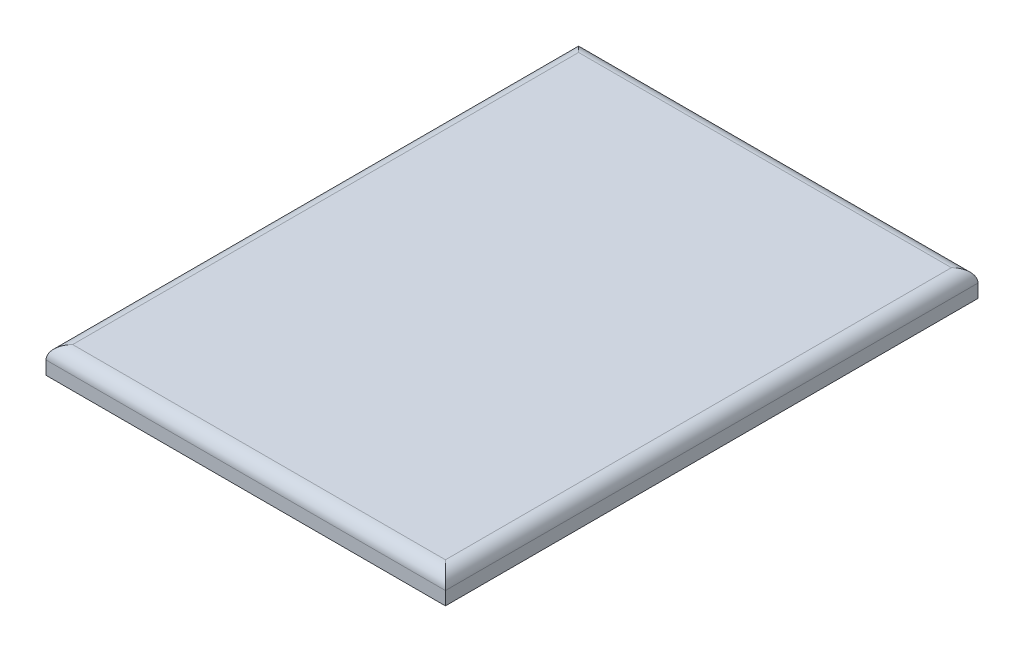
ISO-10303-21;
HEADER;
FILE_DESCRIPTION(('STEP AP214'),'2;1');
FILE_NAME('part.step','',(''),(''),'','','');
FILE_SCHEMA(('AUTOMOTIVE_DESIGN { 1 0 10303 214 1 1 1 1 }'));
ENDSEC;
DATA;
#1=APPLICATION_CONTEXT('core data for automotive mechanical design processes');
#2=APPLICATION_PROTOCOL_DEFINITION('international standard','automotive_design',2000,#1);
#3=PRODUCT_CONTEXT('',#1,'mechanical');
#4=PRODUCT('Part','Part','',(#3));
#5=PRODUCT_RELATED_PRODUCT_CATEGORY('part','',(#4));
#6=PRODUCT_DEFINITION_FORMATION('','',#4);
#7=PRODUCT_DEFINITION_CONTEXT('part definition',#1,'design');
#8=PRODUCT_DEFINITION('design','',#6,#7);
#9=PRODUCT_DEFINITION_SHAPE('','',#8);
#10=(LENGTH_UNIT() NAMED_UNIT(*) SI_UNIT(.MILLI.,.METRE.));
#11=(NAMED_UNIT(*) PLANE_ANGLE_UNIT() SI_UNIT($,.RADIAN.));
#12=(NAMED_UNIT(*) SI_UNIT($,.STERADIAN.) SOLID_ANGLE_UNIT());
#13=UNCERTAINTY_MEASURE_WITH_UNIT(LENGTH_MEASURE(1.E-05),#10,'distance_accuracy_value','');
#14=(GEOMETRIC_REPRESENTATION_CONTEXT(3) GLOBAL_UNCERTAINTY_ASSIGNED_CONTEXT((#13)) GLOBAL_UNIT_ASSIGNED_CONTEXT((#10,
#11,#12)) REPRESENTATION_CONTEXT('',''));
#15=CARTESIAN_POINT('',(0.,0.,0.));
#16=DIRECTION('',(0.,0.,1.));
#17=DIRECTION('',(1.,0.,0.));
#18=AXIS2_PLACEMENT_3D('',#15,#16,#17);
#19=CARTESIAN_POINT('',(1.77852348993288,1.,-11.3758389261745));
#20=DIRECTION('',(1.,0.,0.));
#21=DIRECTION('',(0.,0.,-1.));
#22=AXIS2_PLACEMENT_3D('',#19,#20,#21);
#23=PLANE('',#22);
#24=DIRECTION('',(0.,-1.,0.));
#25=VECTOR('',#24,1.);
#26=CARTESIAN_POINT('',(1.77852348993288,1.,8.6241610738255));
#27=LINE('',#26,#25);
#28=CARTESIAN_POINT('',(1.77852348993288,0.5,8.6241610738255));
#29=VERTEX_POINT('',#28);
#30=CARTESIAN_POINT('',(1.77852348993288,0.,8.6241610738255));
#31=VERTEX_POINT('',#30);
#32=EDGE_CURVE('E86',#29,#31,#27,.T.);
#33=ORIENTED_EDGE('',*,*,#32,.F.);
#34=DIRECTION('',(0.,0.,1.));
#35=VECTOR('',#34,1.);
#36=CARTESIAN_POINT('',(1.77852348993288,0.5,-11.3758389261745));
#37=LINE('',#36,#35);
#38=CARTESIAN_POINT('',(1.77852348993288,0.5,-11.3758389261745));
#39=VERTEX_POINT('',#38);
#40=EDGE_CURVE('E56',#29,#39,#37,.F.);
#41=ORIENTED_EDGE('',*,*,#40,.T.);
#42=DIRECTION('',(0.,-1.,0.));
#43=VECTOR('',#42,1.);
#44=CARTESIAN_POINT('',(1.77852348993288,1.,-11.3758389261745));
#45=LINE('',#44,#43);
#46=CARTESIAN_POINT('',(1.77852348993288,0.,-11.3758389261745));
#47=VERTEX_POINT('',#46);
#48=EDGE_CURVE('E106',#39,#47,#45,.T.);
#49=ORIENTED_EDGE('',*,*,#48,.T.);
#50=DIRECTION('',(0.,0.,1.));
#51=VECTOR('',#50,1.);
#52=CARTESIAN_POINT('',(1.77852348993288,0.,-11.3758389261745));
#53=LINE('',#52,#51);
#54=EDGE_CURVE('E102',#47,#31,#53,.T.);
#55=ORIENTED_EDGE('',*,*,#54,.T.);
#56=EDGE_LOOP('',(#33,#41,#49,#55));
#57=FACE_BOUND('',#56,.T.);
#58=ADVANCED_FACE('F32',(#57),#23,.F.);
#59=CARTESIAN_POINT('',(1.77852348993288,1.,8.6241610738255));
#60=DIRECTION('',(0.,0.,-1.));
#61=DIRECTION('',(-1.,0.,0.));
#62=AXIS2_PLACEMENT_3D('',#59,#60,#61);
#63=PLANE('',#62);
#64=DIRECTION('',(0.,-1.,0.));
#65=VECTOR('',#64,1.);
#66=CARTESIAN_POINT('',(16.7785234899329,1.,8.6241610738255));
#67=LINE('',#66,#65);
#68=CARTESIAN_POINT('',(16.7785234899329,0.5,8.6241610738255));
#69=VERTEX_POINT('',#68);
#70=CARTESIAN_POINT('',(16.7785234899329,0.,8.6241610738255));
#71=VERTEX_POINT('',#70);
#72=EDGE_CURVE('E96',#69,#71,#67,.T.);
#73=ORIENTED_EDGE('',*,*,#72,.F.);
#74=DIRECTION('',(1.,0.,0.));
#75=VECTOR('',#74,1.);
#76=CARTESIAN_POINT('',(1.77852348993288,0.5,8.6241610738255));
#77=LINE('',#76,#75);
#78=EDGE_CURVE('E93',#69,#29,#77,.F.);
#79=ORIENTED_EDGE('',*,*,#78,.T.);
#80=ORIENTED_EDGE('',*,*,#32,.T.);
#81=DIRECTION('',(1.,0.,0.));
#82=VECTOR('',#81,1.);
#83=CARTESIAN_POINT('',(1.77852348993288,0.,8.6241610738255));
#84=LINE('',#83,#82);
#85=EDGE_CURVE('E90',#31,#71,#84,.T.);
#86=ORIENTED_EDGE('',*,*,#85,.T.);
#87=EDGE_LOOP('',(#73,#79,#80,#86));
#88=FACE_BOUND('',#87,.T.);
#89=ADVANCED_FACE('F89',(#88),#63,.F.);
#90=CARTESIAN_POINT('',(16.7785234899329,1.,-11.3758389261745));
#91=DIRECTION('',(-1.,0.,0.));
#92=DIRECTION('',(0.,0.,1.));
#93=AXIS2_PLACEMENT_3D('',#90,#91,#92);
#94=PLANE('',#93);
#95=DIRECTION('',(0.,-1.,0.));
#96=VECTOR('',#95,1.);
#97=CARTESIAN_POINT('',(16.7785234899329,1.,-11.3758389261745));
#98=LINE('',#97,#96);
#99=CARTESIAN_POINT('',(16.7785234899329,0.5,-11.3758389261745));
#100=VERTEX_POINT('',#99);
#101=CARTESIAN_POINT('',(16.7785234899329,0.,-11.3758389261745));
#102=VERTEX_POINT('',#101);
#103=EDGE_CURVE('E116',#100,#102,#98,.T.);
#104=ORIENTED_EDGE('',*,*,#103,.F.);
#105=DIRECTION('',(0.,0.,-1.));
#106=VECTOR('',#105,1.);
#107=CARTESIAN_POINT('',(16.7785234899329,0.5,8.6241610738255));
#108=LINE('',#107,#106);
#109=EDGE_CURVE('E11',#100,#69,#108,.F.);
#110=ORIENTED_EDGE('',*,*,#109,.T.);
#111=ORIENTED_EDGE('',*,*,#72,.T.);
#112=DIRECTION('',(0.,0.,-1.));
#113=VECTOR('',#112,1.);
#114=CARTESIAN_POINT('',(16.7785234899329,0.,-11.3758389261745));
#115=LINE('',#114,#113);
#116=EDGE_CURVE('E104',#71,#102,#115,.T.);
#117=ORIENTED_EDGE('',*,*,#116,.T.);
#118=EDGE_LOOP('',(#104,#110,#111,#117));
#119=FACE_BOUND('',#118,.T.);
#120=ADVANCED_FACE('F163',(#119),#94,.F.);
#121=CARTESIAN_POINT('',(1.77852348993288,1.,-11.3758389261745));
#122=DIRECTION('',(0.,0.,1.));
#123=DIRECTION('',(1.,0.,0.));
#124=AXIS2_PLACEMENT_3D('',#121,#122,#123);
#125=PLANE('',#124);
#126=ORIENTED_EDGE('',*,*,#48,.F.);
#127=DIRECTION('',(-1.,0.,0.));
#128=VECTOR('',#127,1.);
#129=CARTESIAN_POINT('',(16.7785234899329,0.5,-11.3758389261745));
#130=LINE('',#129,#128);
#131=EDGE_CURVE('E41',#39,#100,#130,.F.);
#132=ORIENTED_EDGE('',*,*,#131,.T.);
#133=ORIENTED_EDGE('',*,*,#103,.T.);
#134=DIRECTION('',(-1.,0.,0.));
#135=VECTOR('',#134,1.);
#136=CARTESIAN_POINT('',(1.77852348993288,0.,-11.3758389261745));
#137=LINE('',#136,#135);
#138=EDGE_CURVE('E113',#102,#47,#137,.T.);
#139=ORIENTED_EDGE('',*,*,#138,.T.);
#140=EDGE_LOOP('',(#126,#132,#133,#139));
#141=FACE_BOUND('',#140,.T.);
#142=ADVANCED_FACE('F195',(#141),#125,.F.);
#143=CARTESIAN_POINT('',(0.,1.,0.));
#144=DIRECTION('',(0.,1.,0.));
#145=DIRECTION('',(0.,0.,1.));
#146=AXIS2_PLACEMENT_3D('',#143,#144,#145);
#147=PLANE('',#146);
#148=DIRECTION('',(0.,0.,1.));
#149=VECTOR('',#148,1.);
#150=CARTESIAN_POINT('',(2.27852348993288,1.,8.6241610738255));
#151=LINE('',#150,#149);
#152=CARTESIAN_POINT('',(2.27852348993288,1.,-10.8758389261745));
#153=VERTEX_POINT('',#152);
#154=CARTESIAN_POINT('',(2.27852348993288,1.,8.1241610738255));
#155=VERTEX_POINT('',#154);
#156=EDGE_CURVE('E122',#153,#155,#151,.T.);
#157=ORIENTED_EDGE('',*,*,#156,.T.);
#158=DIRECTION('',(1.,0.,0.));
#159=VECTOR('',#158,1.);
#160=CARTESIAN_POINT('',(16.7785234899329,1.,8.1241610738255));
#161=LINE('',#160,#159);
#162=CARTESIAN_POINT('',(16.2785234899329,1.,8.1241610738255));
#163=VERTEX_POINT('',#162);
#164=EDGE_CURVE('E124',#155,#163,#161,.T.);
#165=ORIENTED_EDGE('',*,*,#164,.T.);
#166=DIRECTION('',(0.,0.,-1.));
#167=VECTOR('',#166,1.);
#168=CARTESIAN_POINT('',(16.2785234899329,1.,-11.3758389261745));
#169=LINE('',#168,#167);
#170=CARTESIAN_POINT('',(16.2785234899329,1.,-10.8758389261745));
#171=VERTEX_POINT('',#170);
#172=EDGE_CURVE('E95',#163,#171,#169,.T.);
#173=ORIENTED_EDGE('',*,*,#172,.T.);
#174=DIRECTION('',(-1.,0.,0.));
#175=VECTOR('',#174,1.);
#176=CARTESIAN_POINT('',(1.77852348993288,1.,-10.8758389261745));
#177=LINE('',#176,#175);
#178=EDGE_CURVE('E120',#171,#153,#177,.T.);
#179=ORIENTED_EDGE('',*,*,#178,.T.);
#180=EDGE_LOOP('',(#157,#165,#173,#179));
#181=FACE_BOUND('',#180,.T.);
#182=ADVANCED_FACE('F145',(#181),#147,.T.);
#183=CARTESIAN_POINT('',(0.,0.,0.));
#184=DIRECTION('',(0.,1.,0.));
#185=DIRECTION('',(0.,0.,1.));
#186=AXIS2_PLACEMENT_3D('',#183,#184,#185);
#187=PLANE('',#186);
#188=ORIENTED_EDGE('',*,*,#54,.F.);
#189=ORIENTED_EDGE('',*,*,#138,.F.);
#190=ORIENTED_EDGE('',*,*,#116,.F.);
#191=ORIENTED_EDGE('',*,*,#85,.F.);
#192=EDGE_LOOP('',(#188,#189,#190,#191));
#193=FACE_BOUND('',#192,.T.);
#194=ADVANCED_FACE('F100',(#193),#187,.F.);
#195=CARTESIAN_POINT('',(0.,0.5,-10.8758389261745));
#196=DIRECTION('',(1.,0.,0.));
#197=DIRECTION('',(0.,0.,-1.));
#198=AXIS2_PLACEMENT_3D('',#195,#196,#197);
#199=CYLINDRICAL_SURFACE('',#198,0.5);
#200=CARTESIAN_POINT('',(16.2785234899329,0.5,-10.8758389261745));
#201=DIRECTION('',(0.707106781186547,0.,0.707106781186548));
#202=DIRECTION('',(-0.707106781186548,0.,0.707106781186547));
#203=AXIS2_PLACEMENT_3D('',#200,#201,#202);
#204=ELLIPSE('',#203,0.707106781186547,0.5);
#205=EDGE_CURVE('E110',#100,#171,#204,.T.);
#206=ORIENTED_EDGE('',*,*,#205,.F.);
#207=ORIENTED_EDGE('',*,*,#131,.F.);
#208=CARTESIAN_POINT('',(2.27852348993288,0.5,-10.8758389261745));
#209=DIRECTION('',(0.707106781186548,0.,-0.707106781186547));
#210=DIRECTION('',(0.707106781186547,0.,0.707106781186548));
#211=AXIS2_PLACEMENT_3D('',#208,#209,#210);
#212=ELLIPSE('',#211,0.707106781186548,0.5);
#213=EDGE_CURVE('E36',#153,#39,#212,.F.);
#214=ORIENTED_EDGE('',*,*,#213,.F.);
#215=ORIENTED_EDGE('',*,*,#178,.F.);
#216=EDGE_LOOP('',(#206,#207,#214,#215));
#217=FACE_BOUND('',#216,.T.);
#218=ADVANCED_FACE('F34',(#217),#199,.T.);
#219=CARTESIAN_POINT('',(2.27852348993288,0.5,0.));
#220=DIRECTION('',(0.,0.,-1.));
#221=DIRECTION('',(-1.,0.,0.));
#222=AXIS2_PLACEMENT_3D('',#219,#220,#221);
#223=CYLINDRICAL_SURFACE('',#222,0.5);
#224=ORIENTED_EDGE('',*,*,#213,.T.);
#225=ORIENTED_EDGE('',*,*,#40,.F.);
#226=CARTESIAN_POINT('',(2.27852348993288,0.5,8.1241610738255));
#227=DIRECTION('',(-0.707106781186547,0.,-0.707106781186547));
#228=DIRECTION('',(0.707106781186547,0.,-0.707106781186547));
#229=AXIS2_PLACEMENT_3D('',#226,#227,#228);
#230=ELLIPSE('',#229,0.707106781186547,0.5);
#231=EDGE_CURVE('E132',#155,#29,#230,.F.);
#232=ORIENTED_EDGE('',*,*,#231,.F.);
#233=ORIENTED_EDGE('',*,*,#156,.F.);
#234=EDGE_LOOP('',(#224,#225,#232,#233));
#235=FACE_BOUND('',#234,.T.);
#236=ADVANCED_FACE('F151',(#235),#223,.T.);
#237=CARTESIAN_POINT('',(16.2785234899329,0.5,0.));
#238=DIRECTION('',(0.,0.,1.));
#239=DIRECTION('',(1.,0.,0.));
#240=AXIS2_PLACEMENT_3D('',#237,#238,#239);
#241=CYLINDRICAL_SURFACE('',#240,0.5);
#242=ORIENTED_EDGE('',*,*,#205,.T.);
#243=ORIENTED_EDGE('',*,*,#172,.F.);
#244=CARTESIAN_POINT('',(16.2785234899329,0.5,8.1241610738255));
#245=DIRECTION('',(-0.707106781186547,0.,0.707106781186547));
#246=DIRECTION('',(0.707106781186547,0.,0.707106781186547));
#247=AXIS2_PLACEMENT_3D('',#244,#245,#246);
#248=ELLIPSE('',#247,0.707106781186547,0.5);
#249=EDGE_CURVE('E130',#69,#163,#248,.T.);
#250=ORIENTED_EDGE('',*,*,#249,.F.);
#251=ORIENTED_EDGE('',*,*,#109,.F.);
#252=EDGE_LOOP('',(#242,#243,#250,#251));
#253=FACE_BOUND('',#252,.T.);
#254=ADVANCED_FACE('F138',(#253),#241,.T.);
#255=CARTESIAN_POINT('',(0.,0.5,8.1241610738255));
#256=DIRECTION('',(-1.,0.,0.));
#257=DIRECTION('',(0.,0.,1.));
#258=AXIS2_PLACEMENT_3D('',#255,#256,#257);
#259=CYLINDRICAL_SURFACE('',#258,0.5);
#260=ORIENTED_EDGE('',*,*,#231,.T.);
#261=ORIENTED_EDGE('',*,*,#78,.F.);
#262=ORIENTED_EDGE('',*,*,#249,.T.);
#263=ORIENTED_EDGE('',*,*,#164,.F.);
#264=EDGE_LOOP('',(#260,#261,#262,#263));
#265=FACE_BOUND('',#264,.T.);
#266=ADVANCED_FACE('F149',(#265),#259,.T.);
#267=CLOSED_SHELL('',(#58,#89,#120,#142,#182,#194,#218,#236,#254,#266));
#268=MANIFOLD_SOLID_BREP('B2',#267);
#269=ADVANCED_BREP_SHAPE_REPRESENTATION('',(#18,#268),#14);
#270=SHAPE_DEFINITION_REPRESENTATION(#9,#269);
ENDSEC;
END-ISO-10303-21;
